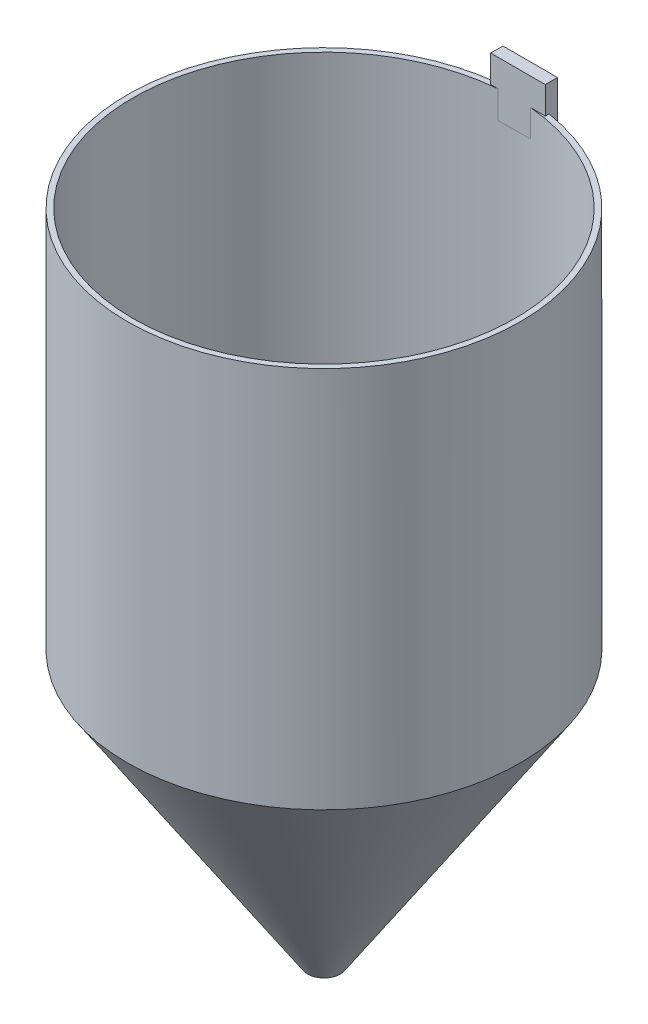
ISO-10303-21;
HEADER;
FILE_DESCRIPTION(('STEP AP214'),'2;1');
FILE_NAME('part.step','',(''),(''),'','','');
FILE_SCHEMA(('AUTOMOTIVE_DESIGN { 1 0 10303 214 1 1 1 1 }'));
ENDSEC;
DATA;
#1=APPLICATION_CONTEXT('core data for automotive mechanical design processes');
#2=APPLICATION_PROTOCOL_DEFINITION('international standard','automotive_design',2000,#1);
#3=PRODUCT_CONTEXT('',#1,'mechanical');
#4=PRODUCT('Part','Part','',(#3));
#5=PRODUCT_RELATED_PRODUCT_CATEGORY('part','',(#4));
#6=PRODUCT_DEFINITION_FORMATION('','',#4);
#7=PRODUCT_DEFINITION_CONTEXT('part definition',#1,'design');
#8=PRODUCT_DEFINITION('design','',#6,#7);
#9=PRODUCT_DEFINITION_SHAPE('','',#8);
#10=(LENGTH_UNIT() NAMED_UNIT(*) SI_UNIT(.MILLI.,.METRE.));
#11=(NAMED_UNIT(*) PLANE_ANGLE_UNIT() SI_UNIT($,.RADIAN.));
#12=(NAMED_UNIT(*) SI_UNIT($,.STERADIAN.) SOLID_ANGLE_UNIT());
#13=UNCERTAINTY_MEASURE_WITH_UNIT(LENGTH_MEASURE(1.E-05),#10,'distance_accuracy_value','');
#14=(GEOMETRIC_REPRESENTATION_CONTEXT(3) GLOBAL_UNCERTAINTY_ASSIGNED_CONTEXT((#13)) GLOBAL_UNIT_ASSIGNED_CONTEXT((#10,
#11,#12)) REPRESENTATION_CONTEXT('',''));
#15=CARTESIAN_POINT('',(0.,0.,0.));
#16=DIRECTION('',(0.,0.,1.));
#17=DIRECTION('',(1.,0.,0.));
#18=AXIS2_PLACEMENT_3D('',#15,#16,#17);
#19=CARTESIAN_POINT('',(3.31083439425001,103.017979097444,0.));
#20=DIRECTION('',(0.,-1.,0.));
#21=DIRECTION('',(0.,0.,-1.));
#22=AXIS2_PLACEMENT_3D('',#19,#20,#21);
#23=PLANE('',#22);
#24=DIRECTION('',(0.,0.,1.));
#25=VECTOR('',#24,1.);
#26=CARTESIAN_POINT('',(-37.0161766031069,103.017979097444,0.));
#27=LINE('',#26,#25);
#28=CARTESIAN_POINT('',(-37.0161766031069,103.017979097444,-35.7390119593247));
#29=VERTEX_POINT('',#28);
#30=CARTESIAN_POINT('',(-37.0161766031069,103.017979097444,-34.8749164235379));
#31=VERTEX_POINT('',#30);
#32=EDGE_CURVE('E122',#29,#31,#27,.T.);
#33=ORIENTED_EDGE('',*,*,#32,.F.);
#34=CARTESIAN_POINT('',(-32.68916560575,103.017979097444,0.));
#35=DIRECTION('',(0.,1.,0.));
#36=DIRECTION('',(0.,0.,1.));
#37=AXIS2_PLACEMENT_3D('',#34,#35,#36);
#38=CIRCLE('',#37,36.);
#39=CARTESIAN_POINT('',(-27.0161766031069,103.017979097444,-35.5502066910432));
#40=VERTEX_POINT('',#39);
#41=EDGE_CURVE('E141',#29,#40,#38,.T.);
#42=ORIENTED_EDGE('',*,*,#41,.T.);
#43=DIRECTION('',(0.,0.,-1.));
#44=VECTOR('',#43,1.);
#45=CARTESIAN_POINT('',(-27.0161766031069,103.017979097444,0.));
#46=LINE('',#45,#44);
#47=CARTESIAN_POINT('',(-27.0161766031069,103.017979097444,-34.8749164235379));
#48=VERTEX_POINT('',#47);
#49=EDGE_CURVE('E129',#48,#40,#46,.T.);
#50=ORIENTED_EDGE('',*,*,#49,.F.);
#51=DIRECTION('',(1.,0.,0.));
#52=VECTOR('',#51,1.);
#53=CARTESIAN_POINT('',(3.31083439425001,103.017979097444,-34.8749164235379));
#54=LINE('',#53,#52);
#55=CARTESIAN_POINT('',(-29.732781927801,103.017979097444,-34.8749164235379));
#56=VERTEX_POINT('',#55);
#57=EDGE_CURVE('E131',#56,#48,#54,.T.);
#58=ORIENTED_EDGE('',*,*,#57,.F.);
#59=CARTESIAN_POINT('',(-32.68916560575,103.017979097444,0.));
#60=DIRECTION('',(0.,1.,0.));
#61=DIRECTION('',(0.,0.,1.));
#62=AXIS2_PLACEMENT_3D('',#59,#60,#61);
#63=CIRCLE('',#62,35.);
#64=CARTESIAN_POINT('',(-35.645549283699,103.017979097444,-34.8749164235379));
#65=VERTEX_POINT('',#64);
#66=EDGE_CURVE('E156',#65,#56,#63,.T.);
#67=ORIENTED_EDGE('',*,*,#66,.F.);
#68=EDGE_CURVE('E54',#31,#65,#54,.T.);
#69=ORIENTED_EDGE('',*,*,#68,.F.);
#70=EDGE_LOOP('',(#33,#42,#50,#58,#67,#69));
#71=FACE_BOUND('',#70,.T.);
#72=ADVANCED_FACE('F33',(#71),#23,.F.);
#73=CARTESIAN_POINT('',(-32.68916560575,34.0199891502495,0.));
#74=DIRECTION('',(0.,1.,0.));
#75=DIRECTION('',(0.,0.,1.));
#76=AXIS2_PLACEMENT_3D('',#73,#74,#75);
#77=CYLINDRICAL_SURFACE('',#76,35.);
#78=CARTESIAN_POINT('',(-32.68916560575,34.0199891502495,0.));
#79=DIRECTION('',(0.,1.,0.));
#80=DIRECTION('',(0.,0.,1.));
#81=AXIS2_PLACEMENT_3D('',#78,#79,#80);
#82=CIRCLE('',#81,35.);
#83=CARTESIAN_POINT('',(-32.68916560575,34.0199891502495,35.));
#84=VERTEX_POINT('',#83);
#85=EDGE_CURVE('E153',#84,#84,#82,.T.);
#86=ORIENTED_EDGE('',*,*,#85,.F.);
#87=EDGE_LOOP('',(#86));
#88=FACE_BOUND('',#87,.T.);
#89=DIRECTION('',(0.,1.,0.));
#90=VECTOR('',#89,1.);
#91=CARTESIAN_POINT('',(-35.645549283699,34.0199891502495,-34.8749164235379));
#92=LINE('',#91,#90);
#93=CARTESIAN_POINT('',(-35.645549283699,98.0179790974435,-34.8749164235379));
#94=VERTEX_POINT('',#93);
#95=EDGE_CURVE('E11',#65,#94,#92,.F.);
#96=ORIENTED_EDGE('',*,*,#95,.F.);
#97=ORIENTED_EDGE('',*,*,#66,.T.);
#98=DIRECTION('',(0.,1.,0.));
#99=VECTOR('',#98,1.);
#100=CARTESIAN_POINT('',(-29.732781927801,34.0199891502495,-34.8749164235379));
#101=LINE('',#100,#99);
#102=CARTESIAN_POINT('',(-29.732781927801,98.0179790974435,-34.8749164235379));
#103=VERTEX_POINT('',#102);
#104=EDGE_CURVE('E40',#103,#56,#101,.T.);
#105=ORIENTED_EDGE('',*,*,#104,.F.);
#106=CARTESIAN_POINT('',(-32.68916560575,98.0179790974435,0.));
#107=DIRECTION('',(0.,-1.,0.));
#108=DIRECTION('',(0.,0.,-1.));
#109=AXIS2_PLACEMENT_3D('',#106,#107,#108);
#110=CIRCLE('',#109,35.);
#111=EDGE_CURVE('E119',#103,#94,#110,.F.);
#112=ORIENTED_EDGE('',*,*,#111,.T.);
#113=EDGE_LOOP('',(#96,#97,#105,#112));
#114=FACE_BOUND('',#113,.T.);
#115=ADVANCED_FACE('F179',(#88,#114),#77,.F.);
#116=CARTESIAN_POINT('',(-32.68916560575,34.0199891502495,0.));
#117=DIRECTION('',(0.,1.,0.));
#118=DIRECTION('',(0.,0.,1.));
#119=AXIS2_PLACEMENT_3D('',#116,#117,#118);
#120=CYLINDRICAL_SURFACE('',#119,36.);
#121=CARTESIAN_POINT('',(-32.68916560575,33.0179790974435,0.));
#122=DIRECTION('',(0.,1.,0.));
#123=DIRECTION('',(0.,0.,1.));
#124=AXIS2_PLACEMENT_3D('',#121,#122,#123);
#125=CIRCLE('',#124,36.);
#126=CARTESIAN_POINT('',(-32.68916560575,33.0179790974435,36.));
#127=VERTEX_POINT('',#126);
#128=EDGE_CURVE('E144',#127,#127,#125,.T.);
#129=ORIENTED_EDGE('',*,*,#128,.T.);
#130=EDGE_LOOP('',(#129));
#131=FACE_BOUND('',#130,.T.);
#132=DIRECTION('',(0.,1.,0.));
#133=VECTOR('',#132,1.);
#134=CARTESIAN_POINT('',(-27.0161766031069,34.0199891502495,-35.5502066910432));
#135=LINE('',#134,#133);
#136=CARTESIAN_POINT('',(-27.0161766031069,98.0179790974435,-35.5502066910432));
#137=VERTEX_POINT('',#136);
#138=EDGE_CURVE('E168',#40,#137,#135,.F.);
#139=ORIENTED_EDGE('',*,*,#138,.F.);
#140=ORIENTED_EDGE('',*,*,#41,.F.);
#141=DIRECTION('',(0.,1.,0.));
#142=VECTOR('',#141,1.);
#143=CARTESIAN_POINT('',(-37.0161766031069,34.0199891502495,-35.7390119593247));
#144=LINE('',#143,#142);
#145=CARTESIAN_POINT('',(-37.0161766031069,98.0179790974435,-35.7390119593247));
#146=VERTEX_POINT('',#145);
#147=EDGE_CURVE('E166',#146,#29,#144,.T.);
#148=ORIENTED_EDGE('',*,*,#147,.F.);
#149=CARTESIAN_POINT('',(-32.68916560575,98.0179790974435,0.));
#150=DIRECTION('',(0.,-1.,0.));
#151=DIRECTION('',(0.,0.,-1.));
#152=AXIS2_PLACEMENT_3D('',#149,#150,#151);
#153=CIRCLE('',#152,36.);
#154=EDGE_CURVE('E159',#146,#137,#153,.T.);
#155=ORIENTED_EDGE('',*,*,#154,.T.);
#156=EDGE_LOOP('',(#139,#140,#148,#155));
#157=FACE_BOUND('',#156,.T.);
#158=ADVANCED_FACE('F196',(#131,#157),#120,.T.);
#159=CARTESIAN_POINT('',(2.31083439425002,34.0199891502495,0.));
#160=DIRECTION('',(0.,-1.,0.));
#161=DIRECTION('',(0.,0.,-1.));
#162=AXIS2_PLACEMENT_3D('',#159,#160,#161);
#163=PLANE('',#162);
#164=CARTESIAN_POINT('',(-14.5838454084553,34.0199891502495,-17.2394135791631));
#165=DIRECTION('',(0.,1.,0.));
#166=DIRECTION('',(0.,0.,1.));
#167=AXIS2_PLACEMENT_3D('',#164,#165,#166);
#168=CIRCLE('',#167,5.);
#169=CARTESIAN_POINT('',(-14.5838454084553,34.0199891502495,-12.2394135791631));
#170=VERTEX_POINT('',#169);
#171=EDGE_CURVE('E133',#170,#170,#168,.T.);
#172=ORIENTED_EDGE('',*,*,#171,.F.);
#173=EDGE_LOOP('',(#172));
#174=FACE_BOUND('',#173,.T.);
#175=CARTESIAN_POINT('',(-32.68916560575,34.0199891502495,0.));
#176=DIRECTION('',(0.,1.,0.));
#177=DIRECTION('',(0.,0.,1.));
#178=AXIS2_PLACEMENT_3D('',#175,#176,#177);
#179=CIRCLE('',#178,2.);
#180=CARTESIAN_POINT('',(-32.68916560575,34.0199891502495,2.));
#181=VERTEX_POINT('',#180);
#182=EDGE_CURVE('E137',#181,#181,#179,.T.);
#183=ORIENTED_EDGE('',*,*,#182,.F.);
#184=EDGE_LOOP('',(#183));
#185=FACE_BOUND('',#184,.T.);
#186=ORIENTED_EDGE('',*,*,#85,.T.);
#187=EDGE_LOOP('',(#186));
#188=FACE_BOUND('',#187,.T.);
#189=ADVANCED_FACE('F222',(#174,#185,#188),#163,.F.);
#190=CARTESIAN_POINT('',(-32.68916560575,33.0199891502495,0.));
#191=DIRECTION('',(0.,1.,0.));
#192=DIRECTION('',(0.,0.,1.));
#193=AXIS2_PLACEMENT_3D('',#190,#191,#192);
#194=PLANE('',#193);
#195=CARTESIAN_POINT('',(-14.5838454084553,33.0199891502495,-17.2394135791631));
#196=DIRECTION('',(0.,1.,0.));
#197=DIRECTION('',(0.,0.,1.));
#198=AXIS2_PLACEMENT_3D('',#195,#196,#197);
#199=CIRCLE('',#198,5.);
#200=CARTESIAN_POINT('',(-14.5838454084553,33.0199891502495,-12.2394135791631));
#201=VERTEX_POINT('',#200);
#202=EDGE_CURVE('E136',#201,#201,#199,.T.);
#203=ORIENTED_EDGE('',*,*,#202,.T.);
#204=EDGE_LOOP('',(#203));
#205=FACE_BOUND('',#204,.T.);
#206=CARTESIAN_POINT('',(-32.68916560575,33.0199891502495,0.));
#207=DIRECTION('',(0.,1.,0.));
#208=DIRECTION('',(0.,0.,1.));
#209=AXIS2_PLACEMENT_3D('',#206,#207,#208);
#210=CIRCLE('',#209,2.);
#211=CARTESIAN_POINT('',(-32.68916560575,33.0199891502495,2.));
#212=VERTEX_POINT('',#211);
#213=EDGE_CURVE('E140',#212,#212,#210,.T.);
#214=ORIENTED_EDGE('',*,*,#213,.T.);
#215=EDGE_LOOP('',(#214));
#216=FACE_BOUND('',#215,.T.);
#217=CARTESIAN_POINT('',(-32.68916560575,33.0199891502495,0.));
#218=DIRECTION('',(0.,1.,0.));
#219=DIRECTION('',(0.,0.,1.));
#220=AXIS2_PLACEMENT_3D('',#217,#218,#219);
#221=CIRCLE('',#220,35.0000020201582);
#222=CARTESIAN_POINT('',(-32.68916560575,33.0199891502495,35.0000020201582));
#223=VERTEX_POINT('',#222);
#224=EDGE_CURVE('E150',#223,#223,#221,.T.);
#225=ORIENTED_EDGE('',*,*,#224,.F.);
#226=EDGE_LOOP('',(#225));
#227=FACE_BOUND('',#226,.T.);
#228=ADVANCED_FACE('F229',(#205,#216,#227),#194,.F.);
#229=CARTESIAN_POINT('',(-32.68916560575,33.0199891502495,0.));
#230=DIRECTION('',(0.,1.,0.));
#231=DIRECTION('',(0.,0.,1.));
#232=AXIS2_PLACEMENT_3D('',#229,#230,#231);
#233=CONICAL_SURFACE('',#232,35.0000020201582,0.569255674125757);
#234=CARTESIAN_POINT('',(-32.68916560575,-16.9820209025565,0.));
#235=DIRECTION('',(0.,1.,0.));
#236=DIRECTION('',(0.,0.,1.));
#237=AXIS2_PLACEMENT_3D('',#234,#235,#236);
#238=CIRCLE('',#237,3.00276939650079);
#239=CARTESIAN_POINT('',(-32.68916560575,-16.9820209025565,3.00276939650079));
#240=VERTEX_POINT('',#239);
#241=EDGE_CURVE('E147',#240,#240,#238,.T.);
#242=CARTESIAN_POINT('',(-32.68916560575,-16.9820209025565,3.00276939650079));
#243=CARTESIAN_POINT('',(-32.68916560575,-16.4611666311731,3.33607390299723));
#244=CARTESIAN_POINT('',(-32.68916560575,-15.9403123597897,3.66937840949366));
#245=CARTESIAN_POINT('',(-32.68916560575,-14.8986038170229,4.33598742248652));
#246=CARTESIAN_POINT('',(-32.68916560575,-14.3777495456395,4.66929192898295));
#247=CARTESIAN_POINT('',(-32.68916560575,-13.3360410028727,5.33590094197581));
#248=CARTESIAN_POINT('',(-32.68916560575,-12.8151867314893,5.66920544847224));
#249=CARTESIAN_POINT('',(-32.68916560575,-11.7734781887225,6.3358144614651));
#250=CARTESIAN_POINT('',(-32.68916560575,-11.2526239173391,6.66911896796154));
#251=CARTESIAN_POINT('',(-32.68916560575,-10.2109153745724,7.3357279809544));
#252=CARTESIAN_POINT('',(-32.68916560575,-9.69006110318896,7.66903248745083));
#253=CARTESIAN_POINT('',(-32.68916560575,-8.64835256042216,8.33564150044369));
#254=CARTESIAN_POINT('',(-32.68916560575,-8.12749828903877,8.66894600694012));
#255=CARTESIAN_POINT('',(-32.68916560575,-7.08578974627198,9.33555501993299));
#256=CARTESIAN_POINT('',(-32.68916560575,-6.56493547488858,9.66885952642942));
#257=CARTESIAN_POINT('',(-32.68916560575,-5.52322693212179,10.3354685394223));
#258=CARTESIAN_POINT('',(-32.68916560575,-5.0023726607384,10.6687730459187));
#259=CARTESIAN_POINT('',(-32.68916560575,-3.96066411797161,11.3353820589116));
#260=CARTESIAN_POINT('',(-32.68916560575,-3.43980984658821,11.668686565408));
#261=CARTESIAN_POINT('',(-32.68916560575,-2.39810130382142,12.3352955784009));
#262=CARTESIAN_POINT('',(-32.68916560575,-1.87724703243802,12.6686000848973));
#263=CARTESIAN_POINT('',(-32.68916560575,-0.835538489671233,13.3352090978902));
#264=CARTESIAN_POINT('',(-32.68916560575,-0.314684218287839,13.6685136043866));
#265=CARTESIAN_POINT('',(-32.68916560575,0.727024324478953,14.3351226173795));
#266=CARTESIAN_POINT('',(-32.68916560575,1.24787859586235,14.6684271238759));
#267=CARTESIAN_POINT('',(-32.68916560575,2.28958713862914,15.3350361368687));
#268=CARTESIAN_POINT('',(-32.68916560575,2.81044141001254,15.6683406433652));
#269=CARTESIAN_POINT('',(-32.68916560575,3.85214995277933,16.334949656358));
#270=CARTESIAN_POINT('',(-32.68916560575,4.37300422416272,16.6682541628545));
#271=CARTESIAN_POINT('',(-32.68916560575,5.41471276692951,17.3348631758473));
#272=CARTESIAN_POINT('',(-32.68916560575,5.93556703831291,17.6681676823438));
#273=CARTESIAN_POINT('',(-32.68916560575,6.9772755810797,18.3347766953366));
#274=CARTESIAN_POINT('',(-32.68916560575,7.4981298524631,18.6680812018331));
#275=CARTESIAN_POINT('',(-32.68916560575,8.53983839522989,19.3346902148259));
#276=CARTESIAN_POINT('',(-32.68916560575,9.06069266661328,19.6679947213224));
#277=CARTESIAN_POINT('',(-32.68916560575,10.1024012093801,20.3346037343152));
#278=CARTESIAN_POINT('',(-32.68916560575,10.6232554807635,20.6679082408116));
#279=CARTESIAN_POINT('',(-32.68916560575,11.6649640235303,21.3345172538045));
#280=CARTESIAN_POINT('',(-32.68916560575,12.1858182949137,21.6678217603009));
#281=CARTESIAN_POINT('',(-32.68916560575,13.2275268376804,22.3344307732938));
#282=CARTESIAN_POINT('',(-32.68916560575,13.7483811090638,22.6677352797902));
#283=CARTESIAN_POINT('',(-32.68916560575,14.7900896518306,23.3343442927831));
#284=CARTESIAN_POINT('',(-32.68916560575,15.310943923214,23.6676487992795));
#285=CARTESIAN_POINT('',(-32.68916560575,16.3526524659808,24.3342578122724));
#286=CARTESIAN_POINT('',(-32.68916560575,16.8735067373642,24.6675623187688));
#287=CARTESIAN_POINT('',(-32.68916560575,17.915215280131,25.3341713317617));
#288=CARTESIAN_POINT('',(-32.68916560575,18.4360695515144,25.6674758382581));
#289=CARTESIAN_POINT('',(-32.68916560575,19.4777780942812,26.334084851251));
#290=CARTESIAN_POINT('',(-32.68916560575,19.9986323656646,26.6673893577474));
#291=CARTESIAN_POINT('',(-32.68916560575,21.0403409084314,27.3339983707403));
#292=CARTESIAN_POINT('',(-32.68916560575,21.5611951798148,27.6673028772367));
#293=CARTESIAN_POINT('',(-32.68916560575,22.6029037225816,28.3339118902296));
#294=CARTESIAN_POINT('',(-32.68916560575,23.123757993965,28.667216396726));
#295=CARTESIAN_POINT('',(-32.68916560575,24.1654665367318,29.3338254097188));
#296=CARTESIAN_POINT('',(-32.68916560575,24.6863208081151,29.6671299162153));
#297=CARTESIAN_POINT('',(-32.68916560575,25.7280293508819,30.3337389292081));
#298=CARTESIAN_POINT('',(-32.68916560575,26.2488836222653,30.6670434357046));
#299=CARTESIAN_POINT('',(-32.68916560575,27.2905921650321,31.3336524486974));
#300=CARTESIAN_POINT('',(-32.68916560575,27.8114464364155,31.6669569551939));
#301=CARTESIAN_POINT('',(-32.68916560575,28.8531549791823,32.3335659681867));
#302=CARTESIAN_POINT('',(-32.68916560575,29.3740092505657,32.6668704746832));
#303=CARTESIAN_POINT('',(-32.68916560575,30.4157177933325,33.333479487676));
#304=CARTESIAN_POINT('',(-32.68916560575,30.9365720647159,33.6667839941724));
#305=CARTESIAN_POINT('',(-32.68916560575,31.9782806074827,34.3333930071653));
#306=CARTESIAN_POINT('',(-32.68916560575,32.4991348788661,34.6666975136617));
#307=CARTESIAN_POINT('',(-32.68916560575,33.0199891502495,35.0000020201582));
#308=B_SPLINE_CURVE_WITH_KNOTS('',3,(#242,#243,#244,#245,#246,#247,#248,#249,#250,#251,#252,
#253,#254,#255,#256,#257,#258,#259,#260,#261,#262,#263,#264,#265,#266,#267,#268,#269,#270,#271,
#272,#273,#274,#275,#276,#277,#278,#279,#280,#281,#282,#283,#284,#285,#286,#287,#288,#289,#290,
#291,#292,#293,#294,#295,#296,#297,#298,#299,#300,#301,#302,#303,#304,#305,#306,#307),
.UNSPECIFIED.,.F.,.F.,(4,2,2,2,2,2,2,2,2,2,2,2,2,2,2,2,2,2,2,2,2,2,2,2,2,2,2,2,2,2,2,2,4),(0.,
1.85510905194881,3.71021810389763,5.56532715584643,7.42043620779524,9.27554525974406,
11.1306543116929,12.9857633636417,14.8408724155905,16.6959814675393,18.5510905194881,
20.4061995714369,22.2613086233857,24.1164176753345,25.9715267272834,27.8266357792322,
29.681744831181,31.5368538831298,33.3919629350786,35.2470719870274,37.1021810389762,
38.957290090925,40.8123991428738,42.6675081948227,44.5226172467715,46.3777262987203,
48.2328353506691,50.0879444026179,51.9430534545667,53.7981625065155,55.6532715584643,
57.5083806104132,59.363489662362),.UNSPECIFIED.);
#309=EDGE_CURVE('BSEAM233',#240,#223,#308,.T.);
#310=ORIENTED_EDGE('',*,*,#241,.F.);
#311=ORIENTED_EDGE('',*,*,#224,.T.);
#312=ORIENTED_EDGE('',*,*,#309,.T.);
#313=ORIENTED_EDGE('',*,*,#309,.F.);
#314=EDGE_LOOP('',(#310,#312,#311,#313));
#315=FACE_BOUND('',#314,.T.);
#316=ADVANCED_FACE('F233',(#315),#233,.F.);
#317=CARTESIAN_POINT('',(-32.68916560575,-16.9820209025565,0.));
#318=DIRECTION('',(0.,1.,0.));
#319=DIRECTION('',(0.,0.,1.));
#320=AXIS2_PLACEMENT_3D('',#317,#318,#319);
#321=CONICAL_SURFACE('',#320,3.00276939650079,0.583334424282502);
#322=CARTESIAN_POINT('',(-32.68916560575,33.0179790974435,36.));
#323=CARTESIAN_POINT('',(-32.68916560575,32.4971457641102,35.6562788478802));
#324=CARTESIAN_POINT('',(-32.68916560575,31.9763124307768,35.3125576957604));
#325=CARTESIAN_POINT('',(-32.68916560575,30.9346457641102,34.6251153915209));
#326=CARTESIAN_POINT('',(-32.68916560575,30.4138124307768,34.2813942394011));
#327=CARTESIAN_POINT('',(-32.68916560575,29.3721457641102,33.5939519351615));
#328=CARTESIAN_POINT('',(-32.68916560575,28.8513124307768,33.2502307830417));
#329=CARTESIAN_POINT('',(-32.68916560575,27.8096457641102,32.5627884788022));
#330=CARTESIAN_POINT('',(-32.68916560575,27.2888124307768,32.2190673266824));
#331=CARTESIAN_POINT('',(-32.68916560575,26.2471457641102,31.5316250224428));
#332=CARTESIAN_POINT('',(-32.68916560575,25.7263124307768,31.187903870323));
#333=CARTESIAN_POINT('',(-32.68916560575,24.6846457641102,30.5004615660835));
#334=CARTESIAN_POINT('',(-32.68916560575,24.1638124307768,30.1567404139637));
#335=CARTESIAN_POINT('',(-32.68916560575,23.1221457641102,29.4692981097241));
#336=CARTESIAN_POINT('',(-32.68916560575,22.6013124307768,29.1255769576043));
#337=CARTESIAN_POINT('',(-32.68916560575,21.5596457641102,28.4381346533648));
#338=CARTESIAN_POINT('',(-32.68916560575,21.0388124307768,28.094413501245));
#339=CARTESIAN_POINT('',(-32.68916560575,19.9971457641102,27.4069711970054));
#340=CARTESIAN_POINT('',(-32.68916560575,19.4763124307768,27.0632500448856));
#341=CARTESIAN_POINT('',(-32.68916560575,18.4346457641102,26.3758077406461));
#342=CARTESIAN_POINT('',(-32.68916560575,17.9138124307768,26.0320865885263));
#343=CARTESIAN_POINT('',(-32.68916560575,16.8721457641102,25.3446442842867));
#344=CARTESIAN_POINT('',(-32.68916560575,16.3513124307768,25.0009231321669));
#345=CARTESIAN_POINT('',(-32.68916560575,15.3096457641102,24.3134808279274));
#346=CARTESIAN_POINT('',(-32.68916560575,14.7888124307768,23.9697596758076));
#347=CARTESIAN_POINT('',(-32.68916560575,13.7471457641102,23.282317371568));
#348=CARTESIAN_POINT('',(-32.68916560575,13.2263124307768,22.9385962194482));
#349=CARTESIAN_POINT('',(-32.68916560575,12.1846457641102,22.2511539152087));
#350=CARTESIAN_POINT('',(-32.68916560575,11.6638124307768,21.9074327630889));
#351=CARTESIAN_POINT('',(-32.68916560575,10.6221457641102,21.2199904588493));
#352=CARTESIAN_POINT('',(-32.68916560575,10.1013124307768,20.8762693067295));
#353=CARTESIAN_POINT('',(-32.68916560575,9.05964576411017,20.18882700249));
#354=CARTESIAN_POINT('',(-32.68916560575,8.53881243077684,19.8451058503702));
#355=CARTESIAN_POINT('',(-32.68916560575,7.49714576411017,19.1576635461306));
#356=CARTESIAN_POINT('',(-32.68916560575,6.97631243077684,18.8139423940108));
#357=CARTESIAN_POINT('',(-32.68916560575,5.93464576411017,18.1265000897713));
#358=CARTESIAN_POINT('',(-32.68916560575,5.41381243077684,17.7827789376515));
#359=CARTESIAN_POINT('',(-32.68916560575,4.37214576411017,17.0953366334119));
#360=CARTESIAN_POINT('',(-32.68916560575,3.85131243077684,16.7516154812921));
#361=CARTESIAN_POINT('',(-32.68916560575,2.80964576411017,16.0641731770526));
#362=CARTESIAN_POINT('',(-32.68916560575,2.28881243077684,15.7204520249328));
#363=CARTESIAN_POINT('',(-32.68916560575,1.24714576411017,15.0330097206932));
#364=CARTESIAN_POINT('',(-32.68916560575,0.72631243077684,14.6892885685734));
#365=CARTESIAN_POINT('',(-32.68916560575,-0.315354235889828,14.0018462643339));
#366=CARTESIAN_POINT('',(-32.68916560575,-0.836187569223161,13.6581251122141));
#367=CARTESIAN_POINT('',(-32.68916560575,-1.87785423588983,12.9706828079745));
#368=CARTESIAN_POINT('',(-32.68916560575,-2.39868756922316,12.6269616558547));
#369=CARTESIAN_POINT('',(-32.68916560575,-3.44035423588983,11.9395193516152));
#370=CARTESIAN_POINT('',(-32.68916560575,-3.96118756922316,11.5957981994954));
#371=CARTESIAN_POINT('',(-32.68916560575,-5.00285423588983,10.9083558952558));
#372=CARTESIAN_POINT('',(-32.68916560575,-5.52368756922316,10.564634743136));
#373=CARTESIAN_POINT('',(-32.68916560575,-6.56535423588983,9.87719243889646));
#374=CARTESIAN_POINT('',(-32.68916560575,-7.08618756922316,9.53347128677667));
#375=CARTESIAN_POINT('',(-32.68916560575,-8.12785423588983,8.84602898253711));
#376=CARTESIAN_POINT('',(-32.68916560575,-8.64868756922316,8.50230783041732));
#377=CARTESIAN_POINT('',(-32.68916560575,-9.69035423588983,7.81486552617775));
#378=CARTESIAN_POINT('',(-32.68916560575,-10.2111875692232,7.47114437405797));
#379=CARTESIAN_POINT('',(-32.68916560575,-11.2528542358898,6.7837020698184));
#380=CARTESIAN_POINT('',(-32.68916560575,-11.7736875692232,6.43998091769862));
#381=CARTESIAN_POINT('',(-32.68916560575,-12.8153542358898,5.75253861345906));
#382=CARTESIAN_POINT('',(-32.68916560575,-13.3361875692232,5.40881746133927));
#383=CARTESIAN_POINT('',(-32.68916560575,-14.3778542358898,4.72137515709971));
#384=CARTESIAN_POINT('',(-32.68916560575,-14.8986875692232,4.37765400497992));
#385=CARTESIAN_POINT('',(-32.68916560575,-15.9403542358898,3.69021170074036));
#386=CARTESIAN_POINT('',(-32.68916560575,-16.4611875692232,3.34649054862057));
#387=CARTESIAN_POINT('',(-32.68916560575,-16.9820209025565,3.00276939650079));
#388=B_SPLINE_CURVE_WITH_KNOTS('',3,(#322,#323,#324,#325,#326,#327,#328,#329,#330,#331,#332,
#333,#334,#335,#336,#337,#338,#339,#340,#341,#342,#343,#344,#345,#346,#347,#348,#349,#350,#351,
#352,#353,#354,#355,#356,#357,#358,#359,#360,#361,#362,#363,#364,#365,#366,#367,#368,#369,#370,
#371,#372,#373,#374,#375,#376,#377,#378,#379,#380,#381,#382,#383,#384,#385,#386,#387),
.UNSPECIFIED.,.F.,.F.,(4,2,2,2,2,2,2,2,2,2,2,2,2,2,2,2,2,2,2,2,2,2,2,2,2,2,2,2,2,2,2,2,4),(0.,
1.87208555459706,3.74417110919411,5.61625666379116,7.48834221838822,9.36042777298527,
11.2325133275823,13.1045988821794,14.9766844367764,16.8487699913735,18.7208555459705,
20.5929411005676,22.4650266551646,24.3371122097617,26.2091977643588,28.0812833189558,
29.9533688735529,31.8254544281499,33.697539982747,35.569625537344,37.4417110919411,
39.3137966465381,41.1858822011352,43.0579677557322,44.9300533103293,46.8021388649264,
48.6742244195234,50.5463099741205,52.4183955287175,54.2904810833146,56.1625666379116,
58.0346521925087,59.9067377471057),.UNSPECIFIED.);
#389=EDGE_CURVE('BSEAM237',#127,#240,#388,.T.);
#390=ORIENTED_EDGE('',*,*,#128,.F.);
#391=ORIENTED_EDGE('',*,*,#241,.T.);
#392=ORIENTED_EDGE('',*,*,#389,.T.);
#393=ORIENTED_EDGE('',*,*,#389,.F.);
#394=EDGE_LOOP('',(#390,#392,#391,#393));
#395=FACE_BOUND('',#394,.T.);
#396=ADVANCED_FACE('F237',(#395),#321,.T.);
#397=CARTESIAN_POINT('',(-32.68916560575,31.0199891502495,0.));
#398=DIRECTION('',(0.,1.,0.));
#399=DIRECTION('',(0.,0.,1.));
#400=AXIS2_PLACEMENT_3D('',#397,#398,#399);
#401=CYLINDRICAL_SURFACE('',#400,2.);
#402=ORIENTED_EDGE('',*,*,#182,.T.);
#403=EDGE_LOOP('',(#402));
#404=FACE_BOUND('',#403,.T.);
#405=ORIENTED_EDGE('',*,*,#213,.F.);
#406=EDGE_LOOP('',(#405));
#407=FACE_BOUND('',#406,.T.);
#408=ADVANCED_FACE('F240',(#404,#407),#401,.F.);
#409=CARTESIAN_POINT('',(-14.5838454084553,31.0199891502495,-17.2394135791631));
#410=DIRECTION('',(0.,1.,0.));
#411=DIRECTION('',(0.,0.,1.));
#412=AXIS2_PLACEMENT_3D('',#409,#410,#411);
#413=CYLINDRICAL_SURFACE('',#412,5.);
#414=ORIENTED_EDGE('',*,*,#171,.T.);
#415=EDGE_LOOP('',(#414));
#416=FACE_BOUND('',#415,.T.);
#417=ORIENTED_EDGE('',*,*,#202,.F.);
#418=EDGE_LOOP('',(#417));
#419=FACE_BOUND('',#418,.T.);
#420=ADVANCED_FACE('F245',(#416,#419),#413,.F.);
#421=CARTESIAN_POINT('',(-37.0161766031069,108.017979097444,-34.8749164235379));
#422=DIRECTION('',(0.,0.,-1.));
#423=DIRECTION('',(-1.,0.,0.));
#424=AXIS2_PLACEMENT_3D('',#421,#422,#423);
#425=PLANE('',#424);
#426=DIRECTION('',(0.,-1.,0.));
#427=VECTOR('',#426,1.);
#428=CARTESIAN_POINT('',(-37.0161766031069,108.017979097444,-34.8749164235379));
#429=LINE('',#428,#427);
#430=CARTESIAN_POINT('',(-37.0161766031069,108.017979097444,-34.8749164235379));
#431=VERTEX_POINT('',#430);
#432=EDGE_CURVE('E124',#431,#31,#429,.T.);
#433=ORIENTED_EDGE('',*,*,#432,.T.);
#434=ORIENTED_EDGE('',*,*,#68,.T.);
#435=ORIENTED_EDGE('',*,*,#95,.T.);
#436=DIRECTION('',(1.,0.,0.));
#437=VECTOR('',#436,1.);
#438=CARTESIAN_POINT('',(-37.0161766031069,98.0179790974435,-34.8749164235379));
#439=LINE('',#438,#437);
#440=EDGE_CURVE('E116',#94,#103,#439,.T.);
#441=ORIENTED_EDGE('',*,*,#440,.T.);
#442=ORIENTED_EDGE('',*,*,#104,.T.);
#443=ORIENTED_EDGE('',*,*,#57,.T.);
#444=DIRECTION('',(0.,-1.,0.));
#445=VECTOR('',#444,1.);
#446=CARTESIAN_POINT('',(-27.0161766031069,108.017979097444,-34.8749164235379));
#447=LINE('',#446,#445);
#448=CARTESIAN_POINT('',(-27.0161766031069,108.017979097444,-34.8749164235379));
#449=VERTEX_POINT('',#448);
#450=EDGE_CURVE('E189',#449,#48,#447,.T.);
#451=ORIENTED_EDGE('',*,*,#450,.F.);
#452=DIRECTION('',(1.,0.,0.));
#453=VECTOR('',#452,1.);
#454=CARTESIAN_POINT('',(-37.0161766031069,108.017979097444,-34.8749164235379));
#455=LINE('',#454,#453);
#456=EDGE_CURVE('E112',#431,#449,#455,.T.);
#457=ORIENTED_EDGE('',*,*,#456,.F.);
#458=EDGE_LOOP('',(#433,#434,#435,#441,#442,#443,#451,#457));
#459=FACE_BOUND('',#458,.T.);
#460=ADVANCED_FACE('F172',(#459),#425,.F.);
#461=CARTESIAN_POINT('',(-27.0161766031069,108.017979097444,-34.8749164235379));
#462=DIRECTION('',(-1.,0.,0.));
#463=DIRECTION('',(0.,0.,1.));
#464=AXIS2_PLACEMENT_3D('',#461,#462,#463);
#465=PLANE('',#464);
#466=ORIENTED_EDGE('',*,*,#450,.T.);
#467=ORIENTED_EDGE('',*,*,#49,.T.);
#468=ORIENTED_EDGE('',*,*,#138,.T.);
#469=DIRECTION('',(0.,0.,-1.));
#470=VECTOR('',#469,1.);
#471=CARTESIAN_POINT('',(-27.0161766031069,98.0179790974435,-34.8749164235379));
#472=LINE('',#471,#470);
#473=CARTESIAN_POINT('',(-27.0161766031069,98.0179790974435,-37.1125015271657));
#474=VERTEX_POINT('',#473);
#475=EDGE_CURVE('E47',#137,#474,#472,.T.);
#476=ORIENTED_EDGE('',*,*,#475,.T.);
#477=DIRECTION('',(0.,-1.,0.));
#478=VECTOR('',#477,1.);
#479=CARTESIAN_POINT('',(-27.0161766031069,108.017979097444,-37.1125015271657));
#480=LINE('',#479,#478);
#481=CARTESIAN_POINT('',(-27.0161766031069,108.017979097444,-37.1125015271657));
#482=VERTEX_POINT('',#481);
#483=EDGE_CURVE('E101',#482,#474,#480,.T.);
#484=ORIENTED_EDGE('',*,*,#483,.F.);
#485=DIRECTION('',(0.,0.,-1.));
#486=VECTOR('',#485,1.);
#487=CARTESIAN_POINT('',(-27.0161766031069,108.017979097444,-34.8749164235379));
#488=LINE('',#487,#486);
#489=EDGE_CURVE('E107',#449,#482,#488,.T.);
#490=ORIENTED_EDGE('',*,*,#489,.F.);
#491=EDGE_LOOP('',(#466,#467,#468,#476,#484,#490));
#492=FACE_BOUND('',#491,.T.);
#493=ADVANCED_FACE('F118',(#492),#465,.F.);
#494=CARTESIAN_POINT('',(-37.0161766031069,108.017979097444,-34.8749164235379));
#495=DIRECTION('',(1.,0.,0.));
#496=DIRECTION('',(0.,0.,-1.));
#497=AXIS2_PLACEMENT_3D('',#494,#495,#496);
#498=PLANE('',#497);
#499=ORIENTED_EDGE('',*,*,#147,.T.);
#500=ORIENTED_EDGE('',*,*,#32,.T.);
#501=ORIENTED_EDGE('',*,*,#432,.F.);
#502=DIRECTION('',(0.,0.,1.));
#503=VECTOR('',#502,1.);
#504=CARTESIAN_POINT('',(-37.0161766031069,108.017979097444,-34.8749164235379));
#505=LINE('',#504,#503);
#506=CARTESIAN_POINT('',(-37.0161766031069,108.017979097444,-37.1125015271657));
#507=VERTEX_POINT('',#506);
#508=EDGE_CURVE('E106',#507,#431,#505,.T.);
#509=ORIENTED_EDGE('',*,*,#508,.F.);
#510=DIRECTION('',(0.,-1.,0.));
#511=VECTOR('',#510,1.);
#512=CARTESIAN_POINT('',(-37.0161766031069,108.017979097444,-37.1125015271657));
#513=LINE('',#512,#511);
#514=CARTESIAN_POINT('',(-37.0161766031069,98.0179790974435,-37.1125015271657));
#515=VERTEX_POINT('',#514);
#516=EDGE_CURVE('E103',#507,#515,#513,.T.);
#517=ORIENTED_EDGE('',*,*,#516,.T.);
#518=DIRECTION('',(0.,0.,1.));
#519=VECTOR('',#518,1.);
#520=CARTESIAN_POINT('',(-37.0161766031069,98.0179790974435,-34.8749164235379));
#521=LINE('',#520,#519);
#522=EDGE_CURVE('E182',#515,#146,#521,.T.);
#523=ORIENTED_EDGE('',*,*,#522,.T.);
#524=EDGE_LOOP('',(#499,#500,#501,#509,#517,#523));
#525=FACE_BOUND('',#524,.T.);
#526=ADVANCED_FACE('F199',(#525),#498,.F.);
#527=CARTESIAN_POINT('',(0.,98.0179790974435,0.));
#528=DIRECTION('',(0.,-1.,0.));
#529=DIRECTION('',(0.,0.,-1.));
#530=AXIS2_PLACEMENT_3D('',#527,#528,#529);
#531=PLANE('',#530);
#532=ORIENTED_EDGE('',*,*,#111,.F.);
#533=ORIENTED_EDGE('',*,*,#440,.F.);
#534=EDGE_LOOP('',(#532,#533));
#535=FACE_BOUND('',#534,.T.);
#536=ADVANCED_FACE('F181',(#535),#531,.T.);
#537=CARTESIAN_POINT('',(-37.0161766031069,108.017979097444,-37.1125015271657));
#538=DIRECTION('',(0.,0.,1.));
#539=DIRECTION('',(1.,0.,0.));
#540=AXIS2_PLACEMENT_3D('',#537,#538,#539);
#541=PLANE('',#540);
#542=DIRECTION('',(-1.,0.,0.));
#543=VECTOR('',#542,1.);
#544=CARTESIAN_POINT('',(-37.0161766031069,98.0179790974435,-37.1125015271657));
#545=LINE('',#544,#543);
#546=EDGE_CURVE('E185',#474,#515,#545,.T.);
#547=ORIENTED_EDGE('',*,*,#546,.T.);
#548=ORIENTED_EDGE('',*,*,#516,.F.);
#549=DIRECTION('',(-1.,0.,0.));
#550=VECTOR('',#549,1.);
#551=CARTESIAN_POINT('',(-37.0161766031069,108.017979097444,-37.1125015271657));
#552=LINE('',#551,#550);
#553=EDGE_CURVE('E97',#482,#507,#552,.T.);
#554=ORIENTED_EDGE('',*,*,#553,.F.);
#555=ORIENTED_EDGE('',*,*,#483,.T.);
#556=EDGE_LOOP('',(#547,#548,#554,#555));
#557=FACE_BOUND('',#556,.T.);
#558=ADVANCED_FACE('F99',(#557),#541,.F.);
#559=CARTESIAN_POINT('',(0.,108.017979097444,0.));
#560=DIRECTION('',(0.,-1.,0.));
#561=DIRECTION('',(0.,0.,-1.));
#562=AXIS2_PLACEMENT_3D('',#559,#560,#561);
#563=PLANE('',#562);
#564=ORIENTED_EDGE('',*,*,#489,.T.);
#565=ORIENTED_EDGE('',*,*,#553,.T.);
#566=ORIENTED_EDGE('',*,*,#508,.T.);
#567=ORIENTED_EDGE('',*,*,#456,.T.);
#568=EDGE_LOOP('',(#564,#565,#566,#567));
#569=FACE_BOUND('',#568,.T.);
#570=ADVANCED_FACE('F110',(#569),#563,.F.);
#571=ORIENTED_EDGE('',*,*,#154,.F.);
#572=ORIENTED_EDGE('',*,*,#522,.F.);
#573=ORIENTED_EDGE('',*,*,#546,.F.);
#574=ORIENTED_EDGE('',*,*,#475,.F.);
#575=EDGE_LOOP('',(#571,#572,#573,#574));
#576=FACE_BOUND('',#575,.T.);
#577=ADVANCED_FACE('F198',(#576),#531,.T.);
#578=CLOSED_SHELL('',(#72,#115,#158,#189,#228,#316,#396,#408,#420,#460,#493,#526,#536,#558,#570,#577));
#579=MANIFOLD_SOLID_BREP('B2',#578);
#580=ADVANCED_BREP_SHAPE_REPRESENTATION('',(#18,#579),#14);
#581=SHAPE_DEFINITION_REPRESENTATION(#9,#580);
ENDSEC;
END-ISO-10303-21;
